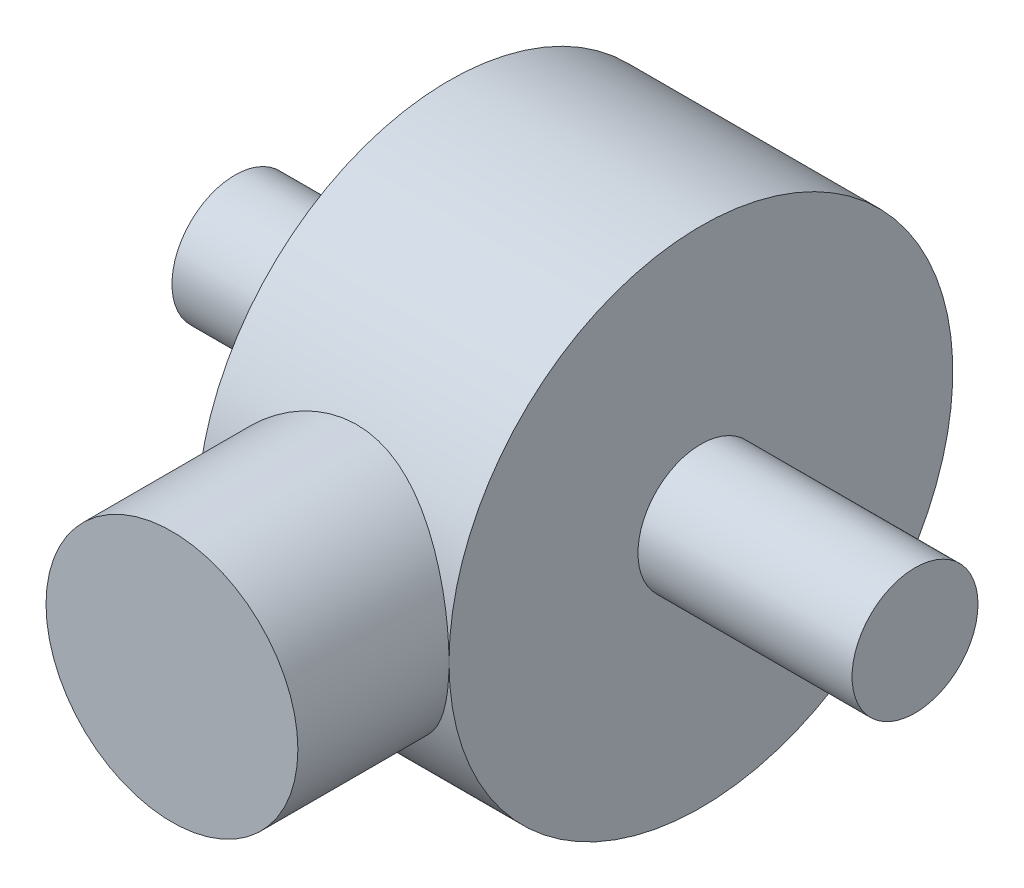
ISO-10303-21;
HEADER;
FILE_DESCRIPTION(('STEP AP214'),'2;1');
FILE_NAME('part.step','',(''),(''),'','','');
FILE_SCHEMA(('AUTOMOTIVE_DESIGN { 1 0 10303 214 1 1 1 1 }'));
ENDSEC;
DATA;
#1=APPLICATION_CONTEXT('core data for automotive mechanical design processes');
#2=APPLICATION_PROTOCOL_DEFINITION('international standard','automotive_design',2000,#1);
#3=PRODUCT_CONTEXT('',#1,'mechanical');
#4=PRODUCT('Part','Part','',(#3));
#5=PRODUCT_RELATED_PRODUCT_CATEGORY('part','',(#4));
#6=PRODUCT_DEFINITION_FORMATION('','',#4);
#7=PRODUCT_DEFINITION_CONTEXT('part definition',#1,'design');
#8=PRODUCT_DEFINITION('design','',#6,#7);
#9=PRODUCT_DEFINITION_SHAPE('','',#8);
#10=(LENGTH_UNIT() NAMED_UNIT(*) SI_UNIT(.MILLI.,.METRE.));
#11=(NAMED_UNIT(*) PLANE_ANGLE_UNIT() SI_UNIT($,.RADIAN.));
#12=(NAMED_UNIT(*) SI_UNIT($,.STERADIAN.) SOLID_ANGLE_UNIT());
#13=UNCERTAINTY_MEASURE_WITH_UNIT(LENGTH_MEASURE(1.E-05),#10,'distance_accuracy_value','');
#14=(GEOMETRIC_REPRESENTATION_CONTEXT(3) GLOBAL_UNCERTAINTY_ASSIGNED_CONTEXT((#13)) GLOBAL_UNIT_ASSIGNED_CONTEXT((#10,
#11,#12)) REPRESENTATION_CONTEXT('',''));
#15=CARTESIAN_POINT('',(0.,0.,0.));
#16=DIRECTION('',(0.,0.,1.));
#17=DIRECTION('',(1.,0.,0.));
#18=AXIS2_PLACEMENT_3D('',#15,#16,#17);
#19=CARTESIAN_POINT('',(12.7,0.,0.));
#20=DIRECTION('',(1.,0.,0.));
#21=DIRECTION('',(0.,0.,-1.));
#22=AXIS2_PLACEMENT_3D('',#19,#20,#21);
#23=PLANE('',#22);
#24=CARTESIAN_POINT('',(12.7,0.,0.));
#25=DIRECTION('',(1.,0.,0.));
#26=DIRECTION('',(0.,0.,-1.));
#27=AXIS2_PLACEMENT_3D('',#24,#25,#26);
#28=CIRCLE('',#27,25.4);
#29=CARTESIAN_POINT('',(12.7,0.,25.4));
#30=VERTEX_POINT('',#29);
#31=EDGE_CURVE('E54',#30,#30,#28,.T.);
#32=ORIENTED_EDGE('',*,*,#31,.T.);
#33=EDGE_LOOP('',(#32));
#34=FACE_BOUND('',#33,.T.);
#35=CARTESIAN_POINT('',(12.7,0.,0.));
#36=DIRECTION('',(1.,0.,0.));
#37=DIRECTION('',(0.,0.,-1.));
#38=AXIS2_PLACEMENT_3D('',#35,#36,#37);
#39=CIRCLE('',#38,6.35);
#40=CARTESIAN_POINT('',(12.7,0.,-6.35));
#41=VERTEX_POINT('',#40);
#42=EDGE_CURVE('E69',#41,#41,#39,.F.);
#43=ORIENTED_EDGE('',*,*,#42,.T.);
#44=EDGE_LOOP('',(#43));
#45=FACE_BOUND('',#44,.T.);
#46=ADVANCED_FACE('F45',(#34,#45),#23,.T.);
#47=CARTESIAN_POINT('',(-12.7,0.,0.));
#48=DIRECTION('',(1.,0.,0.));
#49=DIRECTION('',(0.,0.,-1.));
#50=AXIS2_PLACEMENT_3D('',#47,#48,#49);
#51=PLANE('',#50);
#52=CARTESIAN_POINT('',(-12.7,0.,0.));
#53=DIRECTION('',(1.,0.,0.));
#54=DIRECTION('',(0.,0.,-1.));
#55=AXIS2_PLACEMENT_3D('',#52,#53,#54);
#56=CIRCLE('',#55,25.4);
#57=CARTESIAN_POINT('',(-12.7,0.,25.4));
#58=VERTEX_POINT('',#57);
#59=EDGE_CURVE('E72',#58,#58,#56,.T.);
#60=ORIENTED_EDGE('',*,*,#59,.F.);
#61=EDGE_LOOP('',(#60));
#62=FACE_BOUND('',#61,.T.);
#63=CARTESIAN_POINT('',(-12.7,0.,0.));
#64=DIRECTION('',(1.,0.,0.));
#65=DIRECTION('',(0.,0.,-1.));
#66=AXIS2_PLACEMENT_3D('',#63,#64,#65);
#67=CIRCLE('',#66,6.35);
#68=CARTESIAN_POINT('',(-12.7,0.,-6.35));
#69=VERTEX_POINT('',#68);
#70=EDGE_CURVE('E11',#69,#69,#67,.F.);
#71=ORIENTED_EDGE('',*,*,#70,.F.);
#72=EDGE_LOOP('',(#71));
#73=FACE_BOUND('',#72,.T.);
#74=ADVANCED_FACE('F93',(#62,#73),#51,.F.);
#75=CARTESIAN_POINT('',(12.7,0.,0.));
#76=DIRECTION('',(-1.,0.,0.));
#77=DIRECTION('',(0.,0.,1.));
#78=AXIS2_PLACEMENT_3D('',#75,#76,#77);
#79=CYLINDRICAL_SURFACE('',#78,25.4);
#80=ORIENTED_EDGE('',*,*,#31,.F.);
#81=CARTESIAN_POINT('',(-12.7,0.,25.4));
#82=CARTESIAN_POINT('',(-12.7000075320675,-0.334227902540558,25.4000065559516));
#83=CARTESIAN_POINT('',(-12.6867979012213,-0.668377176531978,25.3933919823737));
#84=CARTESIAN_POINT('',(-12.6341366418875,-1.33418963602365,25.3671214717048));
#85=CARTESIAN_POINT('',(-12.5946796303352,-1.66585229743219,25.3474628594192));
#86=CARTESIAN_POINT('',(-12.4899419134687,-2.32435599102743,25.2955844242962));
#87=CARTESIAN_POINT('',(-12.424638541787,-2.65119252920192,25.2633535764008));
#88=CARTESIAN_POINT('',(-12.2689651877478,-3.29741527842774,25.1871574730545));
#89=CARTESIAN_POINT('',(-12.1785962430799,-3.61680179730913,25.1431927033792));
#90=CARTESIAN_POINT('',(-11.974116779298,-4.24490634901429,25.0447893859015));
#91=CARTESIAN_POINT('',(-11.8600926296096,-4.55365855597044,24.9903889934153));
#92=CARTESIAN_POINT('',(-11.6091906119498,-5.15987551395868,24.8722950084793));
#93=CARTESIAN_POINT('',(-11.4723125768133,-5.45734018240831,24.8086013480541));
#94=CARTESIAN_POINT('',(-11.176878389856,-6.03936145574322,24.6733736675621));
#95=CARTESIAN_POINT('',(-11.018325792984,-6.32392016722454,24.6018409336002));
#96=CARTESIAN_POINT('',(-10.6806250260259,-6.87894063563298,24.4524602707319));
#97=CARTESIAN_POINT('',(-10.5014687345593,-7.14939677226152,24.3746098551618));
#98=CARTESIAN_POINT('',(-10.1123653859141,-7.69075896614907,24.2094415482836));
#99=CARTESIAN_POINT('',(-9.90121395419658,-7.96071182540918,24.1218358475485));
#100=CARTESIAN_POINT('',(-9.45837742405132,-8.48210489403274,23.9434715823924));
#101=CARTESIAN_POINT('',(-9.22669115251155,-8.73354404424296,23.8527128380249));
#102=CARTESIAN_POINT('',(-8.74387729502205,-9.21690636029105,23.6701377759067));
#103=CARTESIAN_POINT('',(-8.49273840730742,-9.44881801508121,23.5783208701441));
#104=CARTESIAN_POINT('',(-7.9722852736554,-9.89189022407132,23.3958955130604));
#105=CARTESIAN_POINT('',(-7.70296762760132,-10.1030468780581,23.3052872916258));
#106=CARTESIAN_POINT('',(-7.12572522534577,-10.5190426808317,23.1206721884566));
#107=CARTESIAN_POINT('',(-6.81642729901838,-10.722108382666,23.0269503792836));
#108=CARTESIAN_POINT('',(-6.17987527381863,-11.1011846654923,22.8466136912253));
#109=CARTESIAN_POINT('',(-5.85262886439005,-11.2772067114832,22.7599958079733));
#110=CARTESIAN_POINT('',(-5.18198539960591,-11.6006709887549,22.5968417352572));
#111=CARTESIAN_POINT('',(-4.83859320751063,-11.7481217583055,22.5203025360663));
#112=CARTESIAN_POINT('',(-4.13780625649295,-12.0128599695755,22.3802068967669));
#113=CARTESIAN_POINT('',(-3.78041305417769,-12.1301507535227,22.3166490182729));
#114=CARTESIAN_POINT('',(-3.07604833735258,-12.3269432039937,22.2085191620235));
#115=CARTESIAN_POINT('',(-2.72973094592115,-12.4082846993322,22.1630393639196));
#116=CARTESIAN_POINT('',(-2.02982189876392,-12.5417986015641,22.0877611180317));
#117=CARTESIAN_POINT('',(-1.6762305548821,-12.5939722562307,22.0579619994459));
#118=CARTESIAN_POINT('',(-0.965183754226731,-12.6683105095499,22.0153527095978));
#119=CARTESIAN_POINT('',(-0.607731812938302,-12.6905004140932,22.0025282121657));
#120=CARTESIAN_POINT('',(0.10795225418277,-12.7045821886231,21.9944009953394));
#121=CARTESIAN_POINT('',(0.466184302321149,-12.6964769492485,21.9990966042482));
#122=CARTESIAN_POINT('',(1.13723108890566,-12.6528993792404,22.0241829776112));
#123=CARTESIAN_POINT('',(1.45034682063444,-12.6208209661067,22.0426266371524));
#124=CARTESIAN_POINT('',(2.07231407933172,-12.5337185881529,22.0922704378058));
#125=CARTESIAN_POINT('',(2.38116600363987,-12.4786967765199,22.1234693818575));
#126=CARTESIAN_POINT('',(2.99267158297997,-12.3463282910739,22.1976105957889));
#127=CARTESIAN_POINT('',(3.29532367433411,-12.2689760577109,22.2405557899634));
#128=CARTESIAN_POINT('',(3.89259360942259,-12.092753050119,22.3368617539041));
#129=CARTESIAN_POINT('',(4.18721102450073,-11.9938811303156,22.3902230781448));
#130=CARTESIAN_POINT('',(4.77356282527101,-11.7729988331913,22.5071646450358));
#131=CARTESIAN_POINT('',(5.06507453849555,-11.6505079979382,22.5709519354986));
#132=CARTESIAN_POINT('',(5.63682334806746,-11.3848861086522,22.7060910151595));
#133=CARTESIAN_POINT('',(5.91705644485921,-11.2417478138017,22.7774454557324));
#134=CARTESIAN_POINT('',(6.46503869042597,-10.9358020974744,22.9259054053455));
#135=CARTESIAN_POINT('',(6.73278547462077,-10.7729909712739,23.0030119965627));
#136=CARTESIAN_POINT('',(7.25471311876847,-10.4286571509734,23.1611528599823));
#137=CARTESIAN_POINT('',(7.50889422741348,-10.2471348000751,23.24218706013));
#138=CARTESIAN_POINT('',(8.03412008592087,-9.84207297352222,23.4168358517742));
#139=CARTESIAN_POINT('',(8.3032140527838,-9.61612448151882,23.5107423630467));
#140=CARTESIAN_POINT('',(8.8217271356287,-9.14277711997623,23.6988288138651));
#141=CARTESIAN_POINT('',(9.07114536218596,-8.89537728180754,23.7930087655724));
#142=CARTESIAN_POINT('',(9.54914614270668,-8.38017609008464,23.9793185349373));
#143=CARTESIAN_POINT('',(9.77771591314373,-8.11236240176926,24.071447068919));
#144=CARTESIAN_POINT('',(10.2124993424938,-7.55771398717195,24.2513085020062));
#145=CARTESIAN_POINT('',(10.4187102255638,-7.27087690625479,24.3390408546028));
#146=CARTESIAN_POINT('',(10.8164945006183,-6.66563477362501,24.5118941448025));
#147=CARTESIAN_POINT('',(11.0069150602108,-6.3463784083698,24.5966955591839));
#148=CARTESIAN_POINT('',(11.3598081577092,-5.6906350303462,24.7566255804175));
#149=CARTESIAN_POINT('',(11.5222930334197,-5.35415570975233,24.8317584536776));
#150=CARTESIAN_POINT('',(11.8174897683826,-4.66654981154601,24.9701035721987));
#151=CARTESIAN_POINT('',(11.9502423373637,-4.31544405203666,25.0333320978423));
#152=CARTESIAN_POINT('',(12.1845846050113,-3.60100265413862,25.1460448564883));
#153=CARTESIAN_POINT('',(12.2861862911563,-3.23767178009932,25.1955343758384));
#154=CARTESIAN_POINT('',(12.480103071579,-2.4015981410771,25.290588646216));
#155=CARTESIAN_POINT('',(12.5623989100097,-1.92594379089569,25.3314357023151));
#156=CARTESIAN_POINT('',(12.6723392204265,-0.96680429874556,25.386135301499));
#157=CARTESIAN_POINT('',(12.6999891080356,-0.483319937549359,25.3999905195763));
#158=CARTESIAN_POINT('',(12.7000075320675,0.334227902540558,25.4000065559516));
#159=CARTESIAN_POINT('',(12.6867979012213,0.668377176531978,25.3933919823737));
#160=CARTESIAN_POINT('',(12.6341366418875,1.33418963602365,25.3671214717048));
#161=CARTESIAN_POINT('',(12.5946796303352,1.66585229743219,25.3474628594192));
#162=CARTESIAN_POINT('',(12.4899419134687,2.32435599102743,25.2955844242962));
#163=CARTESIAN_POINT('',(12.424638541787,2.65119252920192,25.2633535764008));
#164=CARTESIAN_POINT('',(12.2689651877478,3.29741527842774,25.1871574730545));
#165=CARTESIAN_POINT('',(12.1785962430799,3.61680179730913,25.1431927033792));
#166=CARTESIAN_POINT('',(11.974116779298,4.24490634901429,25.0447893859015));
#167=CARTESIAN_POINT('',(11.8600926296096,4.55365855597044,24.9903889934153));
#168=CARTESIAN_POINT('',(11.6091906119498,5.15987551395868,24.8722950084793));
#169=CARTESIAN_POINT('',(11.4723125768133,5.45734018240831,24.8086013480541));
#170=CARTESIAN_POINT('',(11.176878389856,6.03936145574322,24.6733736675621));
#171=CARTESIAN_POINT('',(11.018325792984,6.32392016722454,24.6018409336002));
#172=CARTESIAN_POINT('',(10.6806250260259,6.87894063563298,24.4524602707319));
#173=CARTESIAN_POINT('',(10.5014687345593,7.14939677226152,24.3746098551618));
#174=CARTESIAN_POINT('',(10.1123653859141,7.69075896614907,24.2094415482836));
#175=CARTESIAN_POINT('',(9.90121395419658,7.96071182540917,24.1218358475485));
#176=CARTESIAN_POINT('',(9.45837742405132,8.48210489403274,23.9434715823924));
#177=CARTESIAN_POINT('',(9.22669115251155,8.73354404424296,23.8527128380249));
#178=CARTESIAN_POINT('',(8.74387729502206,9.21690636029105,23.6701377759067));
#179=CARTESIAN_POINT('',(8.49273840730743,9.44881801508121,23.5783208701441));
#180=CARTESIAN_POINT('',(7.9722852736554,9.89189022407132,23.3958955130604));
#181=CARTESIAN_POINT('',(7.70296762760132,10.1030468780581,23.3052872916258));
#182=CARTESIAN_POINT('',(7.12572522534577,10.5190426808317,23.1206721884566));
#183=CARTESIAN_POINT('',(6.81642729901838,10.722108382666,23.0269503792836));
#184=CARTESIAN_POINT('',(6.17987527381863,11.1011846654923,22.8466136912253));
#185=CARTESIAN_POINT('',(5.85262886439004,11.2772067114832,22.7599958079733));
#186=CARTESIAN_POINT('',(5.18198539960591,11.6006709887549,22.5968417352572));
#187=CARTESIAN_POINT('',(4.83859320751063,11.7481217583055,22.5203025360663));
#188=CARTESIAN_POINT('',(4.13780625649295,12.0128599695755,22.3802068967669));
#189=CARTESIAN_POINT('',(3.78041305417769,12.1301507535227,22.3166490182729));
#190=CARTESIAN_POINT('',(3.07604833735258,12.3269432039937,22.2085191620235));
#191=CARTESIAN_POINT('',(2.72973094592115,12.4082846993322,22.1630393639196));
#192=CARTESIAN_POINT('',(2.02982189876392,12.5417986015641,22.0877611180317));
#193=CARTESIAN_POINT('',(1.6762305548821,12.5939722562307,22.0579619994459));
#194=CARTESIAN_POINT('',(0.96518375422673,12.6683105095499,22.0153527095978));
#195=CARTESIAN_POINT('',(0.6077318129383,12.6905004140932,22.0025282121657));
#196=CARTESIAN_POINT('',(-0.107952254182772,12.7045821886231,21.9944009953394));
#197=CARTESIAN_POINT('',(-0.46618430232115,12.6964769492485,21.9990966042482));
#198=CARTESIAN_POINT('',(-1.13723108890566,12.6528993792404,22.0241829776112));
#199=CARTESIAN_POINT('',(-1.45034682063444,12.6208209661067,22.0426266371524));
#200=CARTESIAN_POINT('',(-2.07231407933172,12.5337185881529,22.0922704378058));
#201=CARTESIAN_POINT('',(-2.38116600363986,12.4786967765199,22.1234693818575));
#202=CARTESIAN_POINT('',(-2.99267158297997,12.3463282910739,22.1976105957889));
#203=CARTESIAN_POINT('',(-3.29532367433411,12.2689760577109,22.2405557899634));
#204=CARTESIAN_POINT('',(-3.89259360942259,12.092753050119,22.3368617539041));
#205=CARTESIAN_POINT('',(-4.18721102450073,11.9938811303156,22.3902230781448));
#206=CARTESIAN_POINT('',(-4.77356282527101,11.7729988331913,22.5071646450358));
#207=CARTESIAN_POINT('',(-5.06507453849555,11.6505079979382,22.5709519354986));
#208=CARTESIAN_POINT('',(-5.63682334806746,11.3848861086522,22.7060910151595));
#209=CARTESIAN_POINT('',(-5.91705644485922,11.2417478138017,22.7774454557324));
#210=CARTESIAN_POINT('',(-6.46503869042598,10.9358020974744,22.9259054053455));
#211=CARTESIAN_POINT('',(-6.73278547462078,10.7729909712739,23.0030119965627));
#212=CARTESIAN_POINT('',(-7.25471311876847,10.4286571509734,23.1611528599823));
#213=CARTESIAN_POINT('',(-7.50889422741349,10.2471348000751,23.24218706013));
#214=CARTESIAN_POINT('',(-8.03412008592087,9.84207297352222,23.4168358517742));
#215=CARTESIAN_POINT('',(-8.3032140527838,9.61612448151882,23.5107423630467));
#216=CARTESIAN_POINT('',(-8.8217271356287,9.14277711997622,23.6988288138651));
#217=CARTESIAN_POINT('',(-9.07114536218596,8.89537728180754,23.7930087655724));
#218=CARTESIAN_POINT('',(-9.54914614270668,8.38017609008463,23.9793185349373));
#219=CARTESIAN_POINT('',(-9.77771591314373,8.11236240176926,24.071447068919));
#220=CARTESIAN_POINT('',(-10.2124993424938,7.55771398717195,24.2513085020062));
#221=CARTESIAN_POINT('',(-10.4187102255638,7.27087690625479,24.3390408546028));
#222=CARTESIAN_POINT('',(-10.8164945006183,6.66563477362501,24.5118941448025));
#223=CARTESIAN_POINT('',(-11.0069150602108,6.3463784083698,24.5966955591839));
#224=CARTESIAN_POINT('',(-11.3598081577092,5.69063503034621,24.7566255804175));
#225=CARTESIAN_POINT('',(-11.5222930334197,5.35415570975234,24.8317584536776));
#226=CARTESIAN_POINT('',(-11.8174897683826,4.66654981154602,24.9701035721987));
#227=CARTESIAN_POINT('',(-11.9502423373637,4.31544405203667,25.0333320978423));
#228=CARTESIAN_POINT('',(-12.1845846050113,3.60100265413863,25.1460448564883));
#229=CARTESIAN_POINT('',(-12.2861862911563,3.23767178009932,25.1955343758384));
#230=CARTESIAN_POINT('',(-12.480103071579,2.4015981410771,25.290588646216));
#231=CARTESIAN_POINT('',(-12.5623989100097,1.9259437908957,25.3314357023151));
#232=CARTESIAN_POINT('',(-12.6723392204265,0.966804298745562,25.386135301499));
#233=CARTESIAN_POINT('',(-12.6999891080356,0.48331993754936,25.3999905195763));
#234=CARTESIAN_POINT('',(-12.7,0.,25.4));
#235=B_SPLINE_CURVE_WITH_KNOTS('',3,(#81,#82,#83,#84,#85,#86,#87,#88,#89,#90,#91,#92,#93,#94,
#95,#96,#97,#98,#99,#100,#101,#102,#103,#104,#105,#106,#107,#108,#109,#110,#111,#112,#113,#114,
#115,#116,#117,#118,#119,#120,#121,#122,#123,#124,#125,#126,#127,#128,#129,#130,#131,#132,#133,
#134,#135,#136,#137,#138,#139,#140,#141,#142,#143,#144,#145,#146,#147,#148,#149,#150,#151,#152,
#153,#154,#155,#156,#157,#158,#159,#160,#161,#162,#163,#164,#165,#166,#167,#168,#169,#170,#171,
#172,#173,#174,#175,#176,#177,#178,#179,#180,#181,#182,#183,#184,#185,#186,#187,#188,#189,#190,
#191,#192,#193,#194,#195,#196,#197,#198,#199,#200,#201,#202,#203,#204,#205,#206,#207,#208,#209,
#210,#211,#212,#213,#214,#215,#216,#217,#218,#219,#220,#221,#222,#223,#224,#225,#226,#227,#228,
#229,#230,#231,#232,#233,#234),.UNSPECIFIED.,.T.,.F.,(4,2,2,2,2,2,2,2,2,2,2,2,2,2,2,2,2,2,2,2,2,
2,2,2,2,2,2,2,2,2,2,2,2,2,2,2,2,2,2,2,2,2,2,2,2,2,2,2,2,2,2,2,2,2,2,2,2,2,2,2,2,2,2,2,2,2,2,2,2,
2,2,2,2,2,2,2,4),(0.,1.00222375260369,2.00465311426946,3.00796352675838,4.01123240939895,
5.0109006883724,6.01057627976054,7.01008810584387,8.00999526972287,9.07010118408974,
10.1302676991514,11.1910548476781,12.2520409563423,13.3956759388577,14.5388247381891,
15.6816313890958,16.8243113433993,17.8986842268624,18.9730111461313,20.0464307800791,
21.1197479953307,22.0645179440158,23.0091992480778,23.9541159502457,24.8990829662208,
25.8658135403799,26.832883963357,27.8001367865491,28.7673718715284,29.857299251817,
30.9472758731249,32.0379163983348,33.1286921712796,34.2710336982866,35.4128694064703,
36.5531320134575,37.6929552724024,39.1423936058724,40.5916882872467,41.5939120398504,
42.5963414015161,43.5996518140051,44.6029206966456,45.6025889756191,46.6022645670072,
47.6017763930905,48.6016835569695,49.6617894713364,50.7219559863981,51.7827431349247,
52.843729243589,53.9873642261043,55.1305130254358,56.2733196763425,57.415999630646,
58.4903725141091,59.564699433378,60.6381190673258,61.7114362825774,62.6562062312625,
63.6008875353245,64.5458042374924,65.4907712534675,66.4575018276266,67.4245722506036,
68.3918250737958,69.3590601587751,70.4489875390637,71.5389641603715,72.6296046855815,
73.7203804585263,74.8627219855333,76.004557693717,77.1448203007042,78.284643559649,
79.7340818931191,81.1833765744934),.UNSPECIFIED.);
#236=EDGE_CURVE('E60',#58,#30,#235,.T.);
#237=ORIENTED_EDGE('',*,*,#236,.F.);
#238=ORIENTED_EDGE('',*,*,#59,.T.);
#239=EDGE_CURVE('E62',#30,#58,#235,.T.);
#240=ORIENTED_EDGE('',*,*,#239,.F.);
#241=EDGE_LOOP('',(#80,#237,#238,#240));
#242=FACE_BOUND('',#241,.T.);
#243=ADVANCED_FACE('F47',(#242),#79,.T.);
#244=CARTESIAN_POINT('',(0.,0.,-25.401));
#245=DIRECTION('',(0.,0.,1.));
#246=DIRECTION('',(1.,0.,0.));
#247=AXIS2_PLACEMENT_3D('',#244,#245,#246);
#248=CYLINDRICAL_SURFACE('',#247,12.7);
#249=CARTESIAN_POINT('',(0.,0.,40.64));
#250=DIRECTION('',(0.,0.,1.));
#251=DIRECTION('',(1.,0.,0.));
#252=AXIS2_PLACEMENT_3D('',#249,#250,#251);
#253=CIRCLE('',#252,12.7);
#254=CARTESIAN_POINT('',(12.7,0.,40.64));
#255=VERTEX_POINT('',#254);
#256=EDGE_CURVE('E74',#255,#255,#253,.T.);
#257=ORIENTED_EDGE('',*,*,#256,.F.);
#258=EDGE_LOOP('',(#257));
#259=FACE_BOUND('',#258,.T.);
#260=ORIENTED_EDGE('',*,*,#236,.T.);
#261=ORIENTED_EDGE('',*,*,#239,.T.);
#262=EDGE_LOOP('',(#260,#261));
#263=FACE_BOUND('',#262,.T.);
#264=ADVANCED_FACE('F63',(#259,#263),#248,.T.);
#265=CARTESIAN_POINT('',(0.,0.,40.64));
#266=DIRECTION('',(0.,0.,1.));
#267=DIRECTION('',(1.,0.,0.));
#268=AXIS2_PLACEMENT_3D('',#265,#266,#267);
#269=PLANE('',#268);
#270=ORIENTED_EDGE('',*,*,#256,.T.);
#271=EDGE_LOOP('',(#270));
#272=FACE_BOUND('',#271,.T.);
#273=ADVANCED_FACE('F115',(#272),#269,.T.);
#274=CARTESIAN_POINT('',(-34.29,0.,0.));
#275=DIRECTION('',(1.,0.,0.));
#276=DIRECTION('',(0.,0.,-1.));
#277=AXIS2_PLACEMENT_3D('',#274,#275,#276);
#278=PLANE('',#277);
#279=CARTESIAN_POINT('',(-34.29,0.,0.));
#280=DIRECTION('',(1.,0.,0.));
#281=DIRECTION('',(0.,0.,-1.));
#282=AXIS2_PLACEMENT_3D('',#279,#280,#281);
#283=CIRCLE('',#282,6.35);
#284=CARTESIAN_POINT('',(-34.29,0.,-6.35));
#285=VERTEX_POINT('',#284);
#286=EDGE_CURVE('E195',#285,#285,#283,.T.);
#287=ORIENTED_EDGE('',*,*,#286,.F.);
#288=EDGE_LOOP('',(#287));
#289=FACE_BOUND('',#288,.T.);
#290=ADVANCED_FACE('F106',(#289),#278,.F.);
#291=CARTESIAN_POINT('',(34.29,0.,0.));
#292=DIRECTION('',(-1.,0.,0.));
#293=DIRECTION('',(0.,0.,1.));
#294=AXIS2_PLACEMENT_3D('',#291,#292,#293);
#295=CYLINDRICAL_SURFACE('',#294,6.35);
#296=ORIENTED_EDGE('',*,*,#286,.T.);
#297=EDGE_LOOP('',(#296));
#298=FACE_BOUND('',#297,.T.);
#299=ORIENTED_EDGE('',*,*,#70,.T.);
#300=EDGE_LOOP('',(#299));
#301=FACE_BOUND('',#300,.T.);
#302=ADVANCED_FACE('F103',(#298,#301),#295,.T.);
#303=ORIENTED_EDGE('',*,*,#42,.F.);
#304=EDGE_LOOP('',(#303));
#305=FACE_BOUND('',#304,.T.);
#306=CARTESIAN_POINT('',(34.29,0.,0.));
#307=DIRECTION('',(1.,0.,0.));
#308=DIRECTION('',(0.,0.,-1.));
#309=AXIS2_PLACEMENT_3D('',#306,#307,#308);
#310=CIRCLE('',#309,6.35);
#311=CARTESIAN_POINT('',(34.29,0.,-6.35));
#312=VERTEX_POINT('',#311);
#313=EDGE_CURVE('E193',#312,#312,#310,.T.);
#314=ORIENTED_EDGE('',*,*,#313,.F.);
#315=EDGE_LOOP('',(#314));
#316=FACE_BOUND('',#315,.T.);
#317=ADVANCED_FACE('F105',(#305,#316),#295,.T.);
#318=CARTESIAN_POINT('',(34.29,0.,0.));
#319=DIRECTION('',(1.,0.,0.));
#320=DIRECTION('',(0.,0.,-1.));
#321=AXIS2_PLACEMENT_3D('',#318,#319,#320);
#322=PLANE('',#321);
#323=ORIENTED_EDGE('',*,*,#313,.T.);
#324=EDGE_LOOP('',(#323));
#325=FACE_BOUND('',#324,.T.);
#326=ADVANCED_FACE('F113',(#325),#322,.T.);
#327=CLOSED_SHELL('',(#46,#74,#243,#264,#273,#290,#302,#317,#326));
#328=MANIFOLD_SOLID_BREP('B2',#327);
#329=ADVANCED_BREP_SHAPE_REPRESENTATION('',(#18,#328),#14);
#330=SHAPE_DEFINITION_REPRESENTATION(#9,#329);
ENDSEC;
END-ISO-10303-21;
